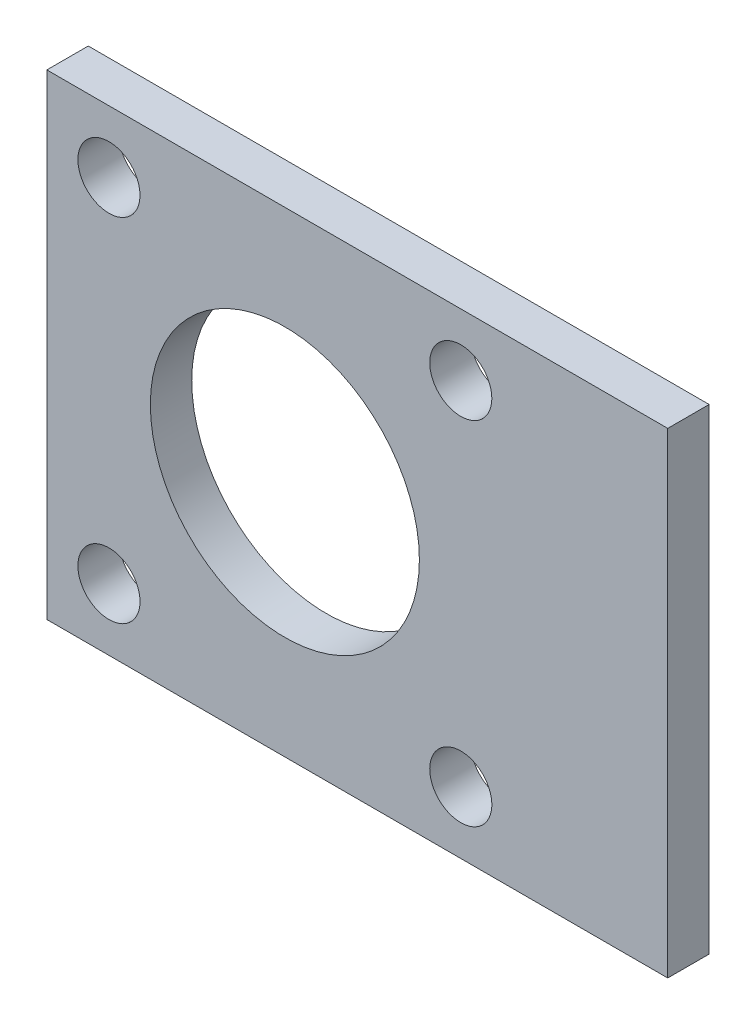
ISO-10303-21;
HEADER;
FILE_DESCRIPTION(('STEP AP214'),'2;1');
FILE_NAME('part.step','',(''),(''),'','','');
FILE_SCHEMA(('AUTOMOTIVE_DESIGN { 1 0 10303 214 1 1 1 1 }'));
ENDSEC;
DATA;
#1=APPLICATION_CONTEXT('core data for automotive mechanical design processes');
#2=APPLICATION_PROTOCOL_DEFINITION('international standard','automotive_design',2000,#1);
#3=PRODUCT_CONTEXT('',#1,'mechanical');
#4=PRODUCT('Part','Part','',(#3));
#5=PRODUCT_RELATED_PRODUCT_CATEGORY('part','',(#4));
#6=PRODUCT_DEFINITION_FORMATION('','',#4);
#7=PRODUCT_DEFINITION_CONTEXT('part definition',#1,'design');
#8=PRODUCT_DEFINITION('design','',#6,#7);
#9=PRODUCT_DEFINITION_SHAPE('','',#8);
#10=(LENGTH_UNIT() NAMED_UNIT(*) SI_UNIT(.MILLI.,.METRE.));
#11=(NAMED_UNIT(*) PLANE_ANGLE_UNIT() SI_UNIT($,.RADIAN.));
#12=(NAMED_UNIT(*) SI_UNIT($,.STERADIAN.) SOLID_ANGLE_UNIT());
#13=UNCERTAINTY_MEASURE_WITH_UNIT(LENGTH_MEASURE(1.E-05),#10,'distance_accuracy_value','');
#14=(GEOMETRIC_REPRESENTATION_CONTEXT(3) GLOBAL_UNCERTAINTY_ASSIGNED_CONTEXT((#13)) GLOBAL_UNIT_ASSIGNED_CONTEXT((#10,
#11,#12)) REPRESENTATION_CONTEXT('',''));
#15=CARTESIAN_POINT('',(0.,0.,0.));
#16=DIRECTION('',(0.,0.,1.));
#17=DIRECTION('',(1.,0.,0.));
#18=AXIS2_PLACEMENT_3D('',#15,#16,#17);
#19=CARTESIAN_POINT('',(-15.,11.5,2.));
#20=DIRECTION('',(1.,0.,0.));
#21=DIRECTION('',(0.,0.,-1.));
#22=AXIS2_PLACEMENT_3D('',#19,#20,#21);
#23=PLANE('',#22);
#24=DIRECTION('',(0.,-1.,0.));
#25=VECTOR('',#24,1.);
#26=CARTESIAN_POINT('',(-15.,11.5,0.));
#27=LINE('',#26,#25);
#28=CARTESIAN_POINT('',(-15.,11.5,0.));
#29=VERTEX_POINT('',#28);
#30=CARTESIAN_POINT('',(-15.,-11.5,0.));
#31=VERTEX_POINT('',#30);
#32=EDGE_CURVE('E94',#29,#31,#27,.T.);
#33=ORIENTED_EDGE('',*,*,#32,.T.);
#34=DIRECTION('',(0.,0.,-1.));
#35=VECTOR('',#34,1.);
#36=CARTESIAN_POINT('',(-15.,-11.5,2.));
#37=LINE('',#36,#35);
#38=CARTESIAN_POINT('',(-15.,-11.5,2.));
#39=VERTEX_POINT('',#38);
#40=EDGE_CURVE('E11',#39,#31,#37,.T.);
#41=ORIENTED_EDGE('',*,*,#40,.F.);
#42=DIRECTION('',(0.,-1.,0.));
#43=VECTOR('',#42,1.);
#44=CARTESIAN_POINT('',(-15.,11.5,2.));
#45=LINE('',#44,#43);
#46=CARTESIAN_POINT('',(-15.,11.5,2.));
#47=VERTEX_POINT('',#46);
#48=EDGE_CURVE('E82',#47,#39,#45,.T.);
#49=ORIENTED_EDGE('',*,*,#48,.F.);
#50=DIRECTION('',(0.,0.,-1.));
#51=VECTOR('',#50,1.);
#52=CARTESIAN_POINT('',(-15.,11.5,2.));
#53=LINE('',#52,#51);
#54=EDGE_CURVE('E90',#47,#29,#53,.T.);
#55=ORIENTED_EDGE('',*,*,#54,.T.);
#56=EDGE_LOOP('',(#33,#41,#49,#55));
#57=FACE_BOUND('',#56,.T.);
#58=ADVANCED_FACE('F31',(#57),#23,.F.);
#59=CARTESIAN_POINT('',(-15.,-11.5,2.));
#60=DIRECTION('',(0.,1.,0.));
#61=DIRECTION('',(0.,0.,1.));
#62=AXIS2_PLACEMENT_3D('',#59,#60,#61);
#63=PLANE('',#62);
#64=DIRECTION('',(1.,0.,0.));
#65=VECTOR('',#64,1.);
#66=CARTESIAN_POINT('',(-15.,-11.5,0.));
#67=LINE('',#66,#65);
#68=CARTESIAN_POINT('',(15.,-11.5,0.));
#69=VERTEX_POINT('',#68);
#70=EDGE_CURVE('E86',#31,#69,#67,.T.);
#71=ORIENTED_EDGE('',*,*,#70,.T.);
#72=DIRECTION('',(0.,0.,-1.));
#73=VECTOR('',#72,1.);
#74=CARTESIAN_POINT('',(15.,-11.5,2.));
#75=LINE('',#74,#73);
#76=CARTESIAN_POINT('',(15.,-11.5,2.));
#77=VERTEX_POINT('',#76);
#78=EDGE_CURVE('E39',#77,#69,#75,.T.);
#79=ORIENTED_EDGE('',*,*,#78,.F.);
#80=DIRECTION('',(1.,0.,0.));
#81=VECTOR('',#80,1.);
#82=CARTESIAN_POINT('',(-15.,-11.5,2.));
#83=LINE('',#82,#81);
#84=EDGE_CURVE('E77',#39,#77,#83,.T.);
#85=ORIENTED_EDGE('',*,*,#84,.F.);
#86=ORIENTED_EDGE('',*,*,#40,.T.);
#87=EDGE_LOOP('',(#71,#79,#85,#86));
#88=FACE_BOUND('',#87,.T.);
#89=ADVANCED_FACE('F85',(#88),#63,.F.);
#90=CARTESIAN_POINT('',(15.,11.5,2.));
#91=DIRECTION('',(-1.,0.,0.));
#92=DIRECTION('',(0.,0.,1.));
#93=AXIS2_PLACEMENT_3D('',#90,#91,#92);
#94=PLANE('',#93);
#95=DIRECTION('',(0.,1.,0.));
#96=VECTOR('',#95,1.);
#97=CARTESIAN_POINT('',(15.,11.5,0.));
#98=LINE('',#97,#96);
#99=CARTESIAN_POINT('',(15.,11.5,0.));
#100=VERTEX_POINT('',#99);
#101=EDGE_CURVE('E64',#69,#100,#98,.T.);
#102=ORIENTED_EDGE('',*,*,#101,.T.);
#103=DIRECTION('',(0.,0.,-1.));
#104=VECTOR('',#103,1.);
#105=CARTESIAN_POINT('',(15.,11.5,2.));
#106=LINE('',#105,#104);
#107=CARTESIAN_POINT('',(15.,11.5,2.));
#108=VERTEX_POINT('',#107);
#109=EDGE_CURVE('E87',#108,#100,#106,.T.);
#110=ORIENTED_EDGE('',*,*,#109,.F.);
#111=DIRECTION('',(0.,1.,0.));
#112=VECTOR('',#111,1.);
#113=CARTESIAN_POINT('',(15.,11.5,2.));
#114=LINE('',#113,#112);
#115=EDGE_CURVE('E80',#77,#108,#114,.T.);
#116=ORIENTED_EDGE('',*,*,#115,.F.);
#117=ORIENTED_EDGE('',*,*,#78,.T.);
#118=EDGE_LOOP('',(#102,#110,#116,#117));
#119=FACE_BOUND('',#118,.T.);
#120=ADVANCED_FACE('F88',(#119),#94,.F.);
#121=CARTESIAN_POINT('',(-15.,11.5,2.));
#122=DIRECTION('',(0.,-1.,0.));
#123=DIRECTION('',(0.,0.,-1.));
#124=AXIS2_PLACEMENT_3D('',#121,#122,#123);
#125=PLANE('',#124);
#126=DIRECTION('',(-1.,0.,0.));
#127=VECTOR('',#126,1.);
#128=CARTESIAN_POINT('',(-15.,11.5,0.));
#129=LINE('',#128,#127);
#130=EDGE_CURVE('E70',#100,#29,#129,.T.);
#131=ORIENTED_EDGE('',*,*,#130,.T.);
#132=ORIENTED_EDGE('',*,*,#54,.F.);
#133=DIRECTION('',(-1.,0.,0.));
#134=VECTOR('',#133,1.);
#135=CARTESIAN_POINT('',(-15.,11.5,2.));
#136=LINE('',#135,#134);
#137=EDGE_CURVE('E47',#108,#47,#136,.T.);
#138=ORIENTED_EDGE('',*,*,#137,.F.);
#139=ORIENTED_EDGE('',*,*,#109,.T.);
#140=EDGE_LOOP('',(#131,#132,#138,#139));
#141=FACE_BOUND('',#140,.T.);
#142=ADVANCED_FACE('F102',(#141),#125,.F.);
#143=CARTESIAN_POINT('',(-15.,-11.5,2.));
#144=DIRECTION('',(0.,0.,1.));
#145=DIRECTION('',(1.,0.,0.));
#146=AXIS2_PLACEMENT_3D('',#143,#144,#145);
#147=PLANE('',#146);
#148=CARTESIAN_POINT('',(-12.,8.5,2.));
#149=DIRECTION('',(0.,0.,1.));
#150=DIRECTION('',(-1.,0.,0.));
#151=AXIS2_PLACEMENT_3D('',#148,#149,#150);
#152=CIRCLE('',#151,1.5);
#153=CARTESIAN_POINT('',(-13.5,8.5,2.));
#154=VERTEX_POINT('',#153);
#155=EDGE_CURVE('E132',#154,#154,#152,.T.);
#156=ORIENTED_EDGE('',*,*,#155,.F.);
#157=EDGE_LOOP('',(#156));
#158=FACE_BOUND('',#157,.T.);
#159=CARTESIAN_POINT('',(-12.,-8.5,2.));
#160=DIRECTION('',(0.,0.,1.));
#161=DIRECTION('',(1.,0.,0.));
#162=AXIS2_PLACEMENT_3D('',#159,#160,#161);
#163=CIRCLE('',#162,1.5);
#164=CARTESIAN_POINT('',(-10.5,-8.5,2.));
#165=VERTEX_POINT('',#164);
#166=EDGE_CURVE('E126',#165,#165,#163,.T.);
#167=ORIENTED_EDGE('',*,*,#166,.F.);
#168=EDGE_LOOP('',(#167));
#169=FACE_BOUND('',#168,.T.);
#170=CARTESIAN_POINT('',(5.,-8.5,2.));
#171=DIRECTION('',(0.,0.,1.));
#172=DIRECTION('',(-1.,0.,0.));
#173=AXIS2_PLACEMENT_3D('',#170,#171,#172);
#174=CIRCLE('',#173,1.5);
#175=CARTESIAN_POINT('',(3.5,-8.5,2.));
#176=VERTEX_POINT('',#175);
#177=EDGE_CURVE('E120',#176,#176,#174,.T.);
#178=ORIENTED_EDGE('',*,*,#177,.F.);
#179=EDGE_LOOP('',(#178));
#180=FACE_BOUND('',#179,.T.);
#181=CARTESIAN_POINT('',(5.,8.5,2.));
#182=DIRECTION('',(0.,0.,1.));
#183=DIRECTION('',(1.,0.,0.));
#184=AXIS2_PLACEMENT_3D('',#181,#182,#183);
#185=CIRCLE('',#184,1.5);
#186=CARTESIAN_POINT('',(6.5,8.5,2.));
#187=VERTEX_POINT('',#186);
#188=EDGE_CURVE('E114',#187,#187,#185,.T.);
#189=ORIENTED_EDGE('',*,*,#188,.F.);
#190=EDGE_LOOP('',(#189));
#191=FACE_BOUND('',#190,.T.);
#192=CARTESIAN_POINT('',(-3.5,0.,2.));
#193=DIRECTION('',(0.,0.,1.));
#194=DIRECTION('',(1.,0.,0.));
#195=AXIS2_PLACEMENT_3D('',#192,#193,#194);
#196=CIRCLE('',#195,6.5);
#197=CARTESIAN_POINT('',(3.,0.,2.));
#198=VERTEX_POINT('',#197);
#199=EDGE_CURVE('E108',#198,#198,#196,.T.);
#200=ORIENTED_EDGE('',*,*,#199,.F.);
#201=EDGE_LOOP('',(#200));
#202=FACE_BOUND('',#201,.T.);
#203=ORIENTED_EDGE('',*,*,#48,.T.);
#204=ORIENTED_EDGE('',*,*,#84,.T.);
#205=ORIENTED_EDGE('',*,*,#115,.T.);
#206=ORIENTED_EDGE('',*,*,#137,.T.);
#207=EDGE_LOOP('',(#203,#204,#205,#206));
#208=FACE_BOUND('',#207,.T.);
#209=ADVANCED_FACE('F78',(#158,#169,#180,#191,#202,#208),#147,.T.);
#210=CARTESIAN_POINT('',(-15.,-11.5,0.));
#211=DIRECTION('',(0.,0.,1.));
#212=DIRECTION('',(1.,0.,0.));
#213=AXIS2_PLACEMENT_3D('',#210,#211,#212);
#214=PLANE('',#213);
#215=CARTESIAN_POINT('',(-12.,8.5,0.));
#216=DIRECTION('',(0.,0.,1.));
#217=DIRECTION('',(-1.,0.,0.));
#218=AXIS2_PLACEMENT_3D('',#215,#216,#217);
#219=CIRCLE('',#218,1.5);
#220=CARTESIAN_POINT('',(-13.5,8.5,0.));
#221=VERTEX_POINT('',#220);
#222=EDGE_CURVE('E129',#221,#221,#219,.T.);
#223=ORIENTED_EDGE('',*,*,#222,.T.);
#224=EDGE_LOOP('',(#223));
#225=FACE_BOUND('',#224,.T.);
#226=CARTESIAN_POINT('',(-12.,-8.5,0.));
#227=DIRECTION('',(0.,0.,1.));
#228=DIRECTION('',(1.,0.,0.));
#229=AXIS2_PLACEMENT_3D('',#226,#227,#228);
#230=CIRCLE('',#229,1.5);
#231=CARTESIAN_POINT('',(-10.5,-8.5,0.));
#232=VERTEX_POINT('',#231);
#233=EDGE_CURVE('E123',#232,#232,#230,.T.);
#234=ORIENTED_EDGE('',*,*,#233,.T.);
#235=EDGE_LOOP('',(#234));
#236=FACE_BOUND('',#235,.T.);
#237=CARTESIAN_POINT('',(5.,-8.5,0.));
#238=DIRECTION('',(0.,0.,1.));
#239=DIRECTION('',(-1.,0.,0.));
#240=AXIS2_PLACEMENT_3D('',#237,#238,#239);
#241=CIRCLE('',#240,1.5);
#242=CARTESIAN_POINT('',(3.5,-8.5,0.));
#243=VERTEX_POINT('',#242);
#244=EDGE_CURVE('E117',#243,#243,#241,.T.);
#245=ORIENTED_EDGE('',*,*,#244,.T.);
#246=EDGE_LOOP('',(#245));
#247=FACE_BOUND('',#246,.T.);
#248=CARTESIAN_POINT('',(5.,8.5,0.));
#249=DIRECTION('',(0.,0.,1.));
#250=DIRECTION('',(1.,0.,0.));
#251=AXIS2_PLACEMENT_3D('',#248,#249,#250);
#252=CIRCLE('',#251,1.5);
#253=CARTESIAN_POINT('',(6.5,8.5,0.));
#254=VERTEX_POINT('',#253);
#255=EDGE_CURVE('E111',#254,#254,#252,.T.);
#256=ORIENTED_EDGE('',*,*,#255,.T.);
#257=EDGE_LOOP('',(#256));
#258=FACE_BOUND('',#257,.T.);
#259=CARTESIAN_POINT('',(-3.5,0.,0.));
#260=DIRECTION('',(0.,0.,1.));
#261=DIRECTION('',(1.,0.,0.));
#262=AXIS2_PLACEMENT_3D('',#259,#260,#261);
#263=CIRCLE('',#262,6.5);
#264=CARTESIAN_POINT('',(3.,0.,0.));
#265=VERTEX_POINT('',#264);
#266=EDGE_CURVE('E97',#265,#265,#263,.T.);
#267=ORIENTED_EDGE('',*,*,#266,.T.);
#268=EDGE_LOOP('',(#267));
#269=FACE_BOUND('',#268,.T.);
#270=ORIENTED_EDGE('',*,*,#32,.F.);
#271=ORIENTED_EDGE('',*,*,#130,.F.);
#272=ORIENTED_EDGE('',*,*,#101,.F.);
#273=ORIENTED_EDGE('',*,*,#70,.F.);
#274=EDGE_LOOP('',(#270,#271,#272,#273));
#275=FACE_BOUND('',#274,.T.);
#276=ADVANCED_FACE('F105',(#225,#236,#247,#258,#269,#275),#214,.F.);
#277=CARTESIAN_POINT('',(-3.5,0.,0.));
#278=DIRECTION('',(0.,0.,1.));
#279=DIRECTION('',(1.,0.,0.));
#280=AXIS2_PLACEMENT_3D('',#277,#278,#279);
#281=CYLINDRICAL_SURFACE('',#280,6.5);
#282=ORIENTED_EDGE('',*,*,#266,.F.);
#283=EDGE_LOOP('',(#282));
#284=FACE_BOUND('',#283,.T.);
#285=ORIENTED_EDGE('',*,*,#199,.T.);
#286=EDGE_LOOP('',(#285));
#287=FACE_BOUND('',#286,.T.);
#288=ADVANCED_FACE('F158',(#284,#287),#281,.F.);
#289=CARTESIAN_POINT('',(5.,8.5,0.));
#290=DIRECTION('',(0.,0.,1.));
#291=DIRECTION('',(1.,0.,0.));
#292=AXIS2_PLACEMENT_3D('',#289,#290,#291);
#293=CYLINDRICAL_SURFACE('',#292,1.5);
#294=ORIENTED_EDGE('',*,*,#255,.F.);
#295=EDGE_LOOP('',(#294));
#296=FACE_BOUND('',#295,.T.);
#297=ORIENTED_EDGE('',*,*,#188,.T.);
#298=EDGE_LOOP('',(#297));
#299=FACE_BOUND('',#298,.T.);
#300=ADVANCED_FACE('F160',(#296,#299),#293,.F.);
#301=CARTESIAN_POINT('',(5.,-8.5,0.));
#302=DIRECTION('',(0.,0.,1.));
#303=DIRECTION('',(1.,0.,0.));
#304=AXIS2_PLACEMENT_3D('',#301,#302,#303);
#305=CYLINDRICAL_SURFACE('',#304,1.5);
#306=ORIENTED_EDGE('',*,*,#244,.F.);
#307=EDGE_LOOP('',(#306));
#308=FACE_BOUND('',#307,.T.);
#309=ORIENTED_EDGE('',*,*,#177,.T.);
#310=EDGE_LOOP('',(#309));
#311=FACE_BOUND('',#310,.T.);
#312=ADVANCED_FACE('F167',(#308,#311),#305,.F.);
#313=CARTESIAN_POINT('',(-12.,-8.5,0.));
#314=DIRECTION('',(0.,0.,1.));
#315=DIRECTION('',(1.,0.,0.));
#316=AXIS2_PLACEMENT_3D('',#313,#314,#315);
#317=CYLINDRICAL_SURFACE('',#316,1.5);
#318=ORIENTED_EDGE('',*,*,#233,.F.);
#319=EDGE_LOOP('',(#318));
#320=FACE_BOUND('',#319,.T.);
#321=ORIENTED_EDGE('',*,*,#166,.T.);
#322=EDGE_LOOP('',(#321));
#323=FACE_BOUND('',#322,.T.);
#324=ADVANCED_FACE('F143',(#320,#323),#317,.F.);
#325=CARTESIAN_POINT('',(-12.,8.5,0.));
#326=DIRECTION('',(0.,0.,1.));
#327=DIRECTION('',(1.,0.,0.));
#328=AXIS2_PLACEMENT_3D('',#325,#326,#327);
#329=CYLINDRICAL_SURFACE('',#328,1.5);
#330=ORIENTED_EDGE('',*,*,#222,.F.);
#331=EDGE_LOOP('',(#330));
#332=FACE_BOUND('',#331,.T.);
#333=ORIENTED_EDGE('',*,*,#155,.T.);
#334=EDGE_LOOP('',(#333));
#335=FACE_BOUND('',#334,.T.);
#336=ADVANCED_FACE('F140',(#332,#335),#329,.F.);
#337=CLOSED_SHELL('',(#58,#89,#120,#142,#209,#276,#288,#300,#312,#324,#336));
#338=MANIFOLD_SOLID_BREP('B2',#337);
#339=ADVANCED_BREP_SHAPE_REPRESENTATION('',(#18,#338),#14);
#340=SHAPE_DEFINITION_REPRESENTATION(#9,#339);
ENDSEC;
END-ISO-10303-21;
